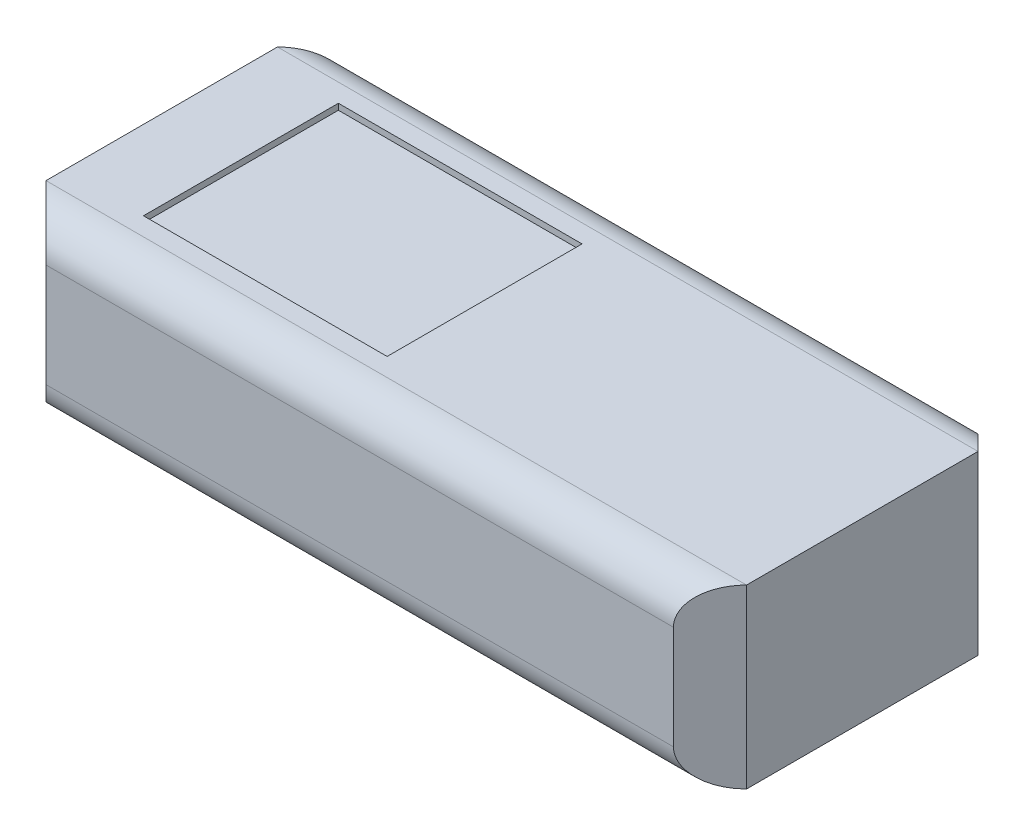
ISO-10303-21;
HEADER;
FILE_DESCRIPTION(('STEP AP214'),'2;1');
FILE_NAME('part.step','',(''),(''),'','','');
FILE_SCHEMA(('AUTOMOTIVE_DESIGN { 1 0 10303 214 1 1 1 1 }'));
ENDSEC;
DATA;
#1=APPLICATION_CONTEXT('core data for automotive mechanical design processes');
#2=APPLICATION_PROTOCOL_DEFINITION('international standard','automotive_design',2000,#1);
#3=PRODUCT_CONTEXT('',#1,'mechanical');
#4=PRODUCT('Part','Part','',(#3));
#5=PRODUCT_RELATED_PRODUCT_CATEGORY('part','',(#4));
#6=PRODUCT_DEFINITION_FORMATION('','',#4);
#7=PRODUCT_DEFINITION_CONTEXT('part definition',#1,'design');
#8=PRODUCT_DEFINITION('design','',#6,#7);
#9=PRODUCT_DEFINITION_SHAPE('','',#8);
#10=(LENGTH_UNIT() NAMED_UNIT(*) SI_UNIT(.MILLI.,.METRE.));
#11=(NAMED_UNIT(*) PLANE_ANGLE_UNIT() SI_UNIT($,.RADIAN.));
#12=(NAMED_UNIT(*) SI_UNIT($,.STERADIAN.) SOLID_ANGLE_UNIT());
#13=UNCERTAINTY_MEASURE_WITH_UNIT(LENGTH_MEASURE(1.E-05),#10,'distance_accuracy_value','');
#14=(GEOMETRIC_REPRESENTATION_CONTEXT(3) GLOBAL_UNCERTAINTY_ASSIGNED_CONTEXT((#13)) GLOBAL_UNIT_ASSIGNED_CONTEXT((#10,
#11,#12)) REPRESENTATION_CONTEXT('',''));
#15=CARTESIAN_POINT('',(0.,0.,0.));
#16=DIRECTION('',(0.,0.,1.));
#17=DIRECTION('',(1.,0.,0.));
#18=AXIS2_PLACEMENT_3D('',#15,#16,#17);
#19=CARTESIAN_POINT('',(-57.5,29.,-25.));
#20=DIRECTION('',(1.,0.,0.));
#21=DIRECTION('',(0.,0.,-1.));
#22=AXIS2_PLACEMENT_3D('',#19,#20,#21);
#23=PLANE('',#22);
#24=DIRECTION('',(0.,-0.26600110526299,0.963972723679912));
#25=VECTOR('',#24,1.);
#26=CARTESIAN_POINT('',(-57.5,13.3262467276994,-8.75017397481112));
#27=LINE('',#26,#25);
#28=CARTESIAN_POINT('',(-57.5,13.3262467276994,-8.75017397481112));
#29=VERTEX_POINT('',#28);
#30=CARTESIAN_POINT('',(-57.5,12.1169292628953,-4.36767695778415));
#31=VERTEX_POINT('',#30);
#32=EDGE_CURVE('E178',#29,#31,#27,.T.);
#33=ORIENTED_EDGE('',*,*,#32,.F.);
#34=CARTESIAN_POINT('',(-57.5,16.1510721858562,-7.9706843942592));
#35=DIRECTION('',(-1.,0.,0.));
#36=DIRECTION('',(0.,0.,1.));
#37=AXIS2_PLACEMENT_3D('',#34,#35,#36);
#38=CIRCLE('',#37,2.93039978078759);
#39=CARTESIAN_POINT('',(-57.5,18.9319085366982,-7.04645927824277));
#40=VERTEX_POINT('',#39);
#41=EDGE_CURVE('E48',#40,#29,#38,.T.);
#42=ORIENTED_EDGE('',*,*,#41,.F.);
#43=DIRECTION('',(0.,0.301819482473594,-0.953365092710747));
#44=VECTOR('',#43,1.);
#45=CARTESIAN_POINT('',(-57.5,18.9319085366982,-7.04645927824277));
#46=LINE('',#45,#44);
#47=CARTESIAN_POINT('',(-57.5,17.5208448838448,-2.58929561472373));
#48=VERTEX_POINT('',#47);
#49=EDGE_CURVE('E166',#48,#40,#46,.T.);
#50=ORIENTED_EDGE('',*,*,#49,.F.);
#51=CARTESIAN_POINT('',(-57.5,12.1497103450549,4.63226334205409));
#52=DIRECTION('',(-1.,0.,0.));
#53=DIRECTION('',(0.,0.,1.));
#54=AXIS2_PLACEMENT_3D('',#51,#52,#53);
#55=CIRCLE('',#54,9.);
#56=EDGE_CURVE('E169',#31,#48,#55,.T.);
#57=ORIENTED_EDGE('',*,*,#56,.F.);
#58=EDGE_LOOP('',(#33,#42,#50,#57));
#59=FACE_BOUND('',#58,.T.);
#60=DIRECTION('',(0.,0.,1.));
#61=VECTOR('',#60,1.);
#62=CARTESIAN_POINT('',(-57.5,29.,-25.));
#63=LINE('',#62,#61);
#64=CARTESIAN_POINT('',(-57.5,29.,-19.));
#65=VERTEX_POINT('',#64);
#66=CARTESIAN_POINT('',(-57.5,29.,19.));
#67=VERTEX_POINT('',#66);
#68=EDGE_CURVE('E219',#65,#67,#63,.T.);
#69=ORIENTED_EDGE('',*,*,#68,.F.);
#70=DIRECTION('',(0.,-1.,0.));
#71=VECTOR('',#70,1.);
#72=CARTESIAN_POINT('',(-57.5,29.,-19.));
#73=LINE('',#72,#71);
#74=CARTESIAN_POINT('',(-57.5,0.,-19.));
#75=VERTEX_POINT('',#74);
#76=EDGE_CURVE('E233',#65,#75,#73,.T.);
#77=ORIENTED_EDGE('',*,*,#76,.T.);
#78=DIRECTION('',(0.,0.,1.));
#79=VECTOR('',#78,1.);
#80=CARTESIAN_POINT('',(-57.5,0.,-25.));
#81=LINE('',#80,#79);
#82=CARTESIAN_POINT('',(-57.5,0.,19.));
#83=VERTEX_POINT('',#82);
#84=EDGE_CURVE('E213',#75,#83,#81,.T.);
#85=ORIENTED_EDGE('',*,*,#84,.T.);
#86=DIRECTION('',(0.,1.,0.));
#87=VECTOR('',#86,1.);
#88=CARTESIAN_POINT('',(-57.5,29.,19.));
#89=LINE('',#88,#87);
#90=EDGE_CURVE('E226',#83,#67,#89,.T.);
#91=ORIENTED_EDGE('',*,*,#90,.T.);
#92=EDGE_LOOP('',(#69,#77,#85,#91));
#93=FACE_BOUND('',#92,.T.);
#94=ADVANCED_FACE('F33',(#59,#93),#23,.F.);
#95=CARTESIAN_POINT('',(-57.5,29.,25.));
#96=DIRECTION('',(0.,0.,-1.));
#97=DIRECTION('',(-1.,0.,0.));
#98=AXIS2_PLACEMENT_3D('',#95,#96,#97);
#99=PLANE('',#98);
#100=DIRECTION('',(0.,-1.,0.));
#101=VECTOR('',#100,1.);
#102=CARTESIAN_POINT('',(-51.5,29.,25.));
#103=LINE('',#102,#101);
#104=CARTESIAN_POINT('',(-51.5,23.,25.));
#105=VERTEX_POINT('',#104);
#106=CARTESIAN_POINT('',(-51.5,6.,25.));
#107=VERTEX_POINT('',#106);
#108=EDGE_CURVE('E251',#105,#107,#103,.T.);
#109=ORIENTED_EDGE('',*,*,#108,.T.);
#110=DIRECTION('',(1.,0.,0.));
#111=VECTOR('',#110,1.);
#112=CARTESIAN_POINT('',(-57.5,6.,25.));
#113=LINE('',#112,#111);
#114=CARTESIAN_POINT('',(51.5,6.,25.));
#115=VERTEX_POINT('',#114);
#116=EDGE_CURVE('E256',#107,#115,#113,.T.);
#117=ORIENTED_EDGE('',*,*,#116,.T.);
#118=DIRECTION('',(0.,1.,0.));
#119=VECTOR('',#118,1.);
#120=CARTESIAN_POINT('',(51.5,29.,25.));
#121=LINE('',#120,#119);
#122=CARTESIAN_POINT('',(51.5,23.,25.));
#123=VERTEX_POINT('',#122);
#124=EDGE_CURVE('E248',#115,#123,#121,.T.);
#125=ORIENTED_EDGE('',*,*,#124,.T.);
#126=DIRECTION('',(1.,0.,0.));
#127=VECTOR('',#126,1.);
#128=CARTESIAN_POINT('',(-51.5,23.,25.));
#129=LINE('',#128,#127);
#130=EDGE_CURVE('E254',#123,#105,#129,.F.);
#131=ORIENTED_EDGE('',*,*,#130,.T.);
#132=EDGE_LOOP('',(#109,#117,#125,#131));
#133=FACE_BOUND('',#132,.T.);
#134=ADVANCED_FACE('F306',(#133),#99,.F.);
#135=CARTESIAN_POINT('',(57.5,29.,-25.));
#136=DIRECTION('',(-1.,0.,0.));
#137=DIRECTION('',(0.,0.,1.));
#138=AXIS2_PLACEMENT_3D('',#135,#136,#137);
#139=PLANE('',#138);
#140=DIRECTION('',(0.,0.,-1.));
#141=VECTOR('',#140,1.);
#142=CARTESIAN_POINT('',(57.5,0.,-25.));
#143=LINE('',#142,#141);
#144=CARTESIAN_POINT('',(57.5,0.,19.));
#145=VERTEX_POINT('',#144);
#146=CARTESIAN_POINT('',(57.5,0.,-19.));
#147=VERTEX_POINT('',#146);
#148=EDGE_CURVE('E223',#145,#147,#143,.T.);
#149=ORIENTED_EDGE('',*,*,#148,.T.);
#150=DIRECTION('',(0.,1.,0.));
#151=VECTOR('',#150,1.);
#152=CARTESIAN_POINT('',(57.5,29.,-19.));
#153=LINE('',#152,#151);
#154=CARTESIAN_POINT('',(57.5,29.,-19.));
#155=VERTEX_POINT('',#154);
#156=EDGE_CURVE('E245',#147,#155,#153,.T.);
#157=ORIENTED_EDGE('',*,*,#156,.T.);
#158=DIRECTION('',(0.,0.,-1.));
#159=VECTOR('',#158,1.);
#160=CARTESIAN_POINT('',(57.5,29.,-25.));
#161=LINE('',#160,#159);
#162=CARTESIAN_POINT('',(57.5,29.,19.));
#163=VERTEX_POINT('',#162);
#164=EDGE_CURVE('E222',#163,#155,#161,.T.);
#165=ORIENTED_EDGE('',*,*,#164,.F.);
#166=DIRECTION('',(0.,-1.,0.));
#167=VECTOR('',#166,1.);
#168=CARTESIAN_POINT('',(57.5,29.,19.));
#169=LINE('',#168,#167);
#170=EDGE_CURVE('E242',#163,#145,#169,.T.);
#171=ORIENTED_EDGE('',*,*,#170,.T.);
#172=EDGE_LOOP('',(#149,#157,#165,#171));
#173=FACE_BOUND('',#172,.T.);
#174=ADVANCED_FACE('F294',(#173),#139,.F.);
#175=CARTESIAN_POINT('',(-57.5,29.,-25.));
#176=DIRECTION('',(0.,0.,1.));
#177=DIRECTION('',(1.,0.,0.));
#178=AXIS2_PLACEMENT_3D('',#175,#176,#177);
#179=PLANE('',#178);
#180=DIRECTION('',(0.,-1.,0.));
#181=VECTOR('',#180,1.);
#182=CARTESIAN_POINT('',(51.5,29.,-25.));
#183=LINE('',#182,#181);
#184=CARTESIAN_POINT('',(51.5,23.,-25.));
#185=VERTEX_POINT('',#184);
#186=CARTESIAN_POINT('',(51.5,6.,-25.));
#187=VERTEX_POINT('',#186);
#188=EDGE_CURVE('E236',#185,#187,#183,.T.);
#189=ORIENTED_EDGE('',*,*,#188,.T.);
#190=DIRECTION('',(-1.,0.,0.));
#191=VECTOR('',#190,1.);
#192=CARTESIAN_POINT('',(-57.5,6.,-25.));
#193=LINE('',#192,#191);
#194=CARTESIAN_POINT('',(-51.5,6.,-25.));
#195=VERTEX_POINT('',#194);
#196=EDGE_CURVE('E273',#187,#195,#193,.T.);
#197=ORIENTED_EDGE('',*,*,#196,.T.);
#198=DIRECTION('',(0.,1.,0.));
#199=VECTOR('',#198,1.);
#200=CARTESIAN_POINT('',(-51.5,29.,-25.));
#201=LINE('',#200,#199);
#202=CARTESIAN_POINT('',(-51.5,23.,-25.));
#203=VERTEX_POINT('',#202);
#204=EDGE_CURVE('E239',#195,#203,#201,.T.);
#205=ORIENTED_EDGE('',*,*,#204,.T.);
#206=DIRECTION('',(-1.,0.,0.));
#207=VECTOR('',#206,1.);
#208=CARTESIAN_POINT('',(51.5,23.,-25.));
#209=LINE('',#208,#207);
#210=EDGE_CURVE('E271',#203,#185,#209,.F.);
#211=ORIENTED_EDGE('',*,*,#210,.T.);
#212=EDGE_LOOP('',(#189,#197,#205,#211));
#213=FACE_BOUND('',#212,.T.);
#214=ADVANCED_FACE('F358',(#213),#179,.F.);
#215=CARTESIAN_POINT('',(-57.5,29.,25.));
#216=DIRECTION('',(0.,1.,0.));
#217=DIRECTION('',(0.,0.,1.));
#218=AXIS2_PLACEMENT_3D('',#215,#216,#217);
#219=PLANE('',#218);
#220=DIRECTION('',(0.,0.,1.));
#221=VECTOR('',#220,1.);
#222=CARTESIAN_POINT('',(-44.5,29.,-16.));
#223=LINE('',#222,#221);
#224=CARTESIAN_POINT('',(-44.5,29.,-16.));
#225=VERTEX_POINT('',#224);
#226=CARTESIAN_POINT('',(-44.5,29.,16.));
#227=VERTEX_POINT('',#226);
#228=EDGE_CURVE('E56',#225,#227,#223,.T.);
#229=ORIENTED_EDGE('',*,*,#228,.F.);
#230=DIRECTION('',(-1.,0.,0.));
#231=VECTOR('',#230,1.);
#232=CARTESIAN_POINT('',(-44.5,29.,-16.));
#233=LINE('',#232,#231);
#234=CARTESIAN_POINT('',(-4.50000000000001,29.,-16.));
#235=VERTEX_POINT('',#234);
#236=EDGE_CURVE('E192',#235,#225,#233,.T.);
#237=ORIENTED_EDGE('',*,*,#236,.F.);
#238=DIRECTION('',(0.,0.,-1.));
#239=VECTOR('',#238,1.);
#240=CARTESIAN_POINT('',(-4.50000000000001,29.,-16.));
#241=LINE('',#240,#239);
#242=CARTESIAN_POINT('',(-4.50000000000001,29.,16.));
#243=VERTEX_POINT('',#242);
#244=EDGE_CURVE('E206',#243,#235,#241,.T.);
#245=ORIENTED_EDGE('',*,*,#244,.F.);
#246=DIRECTION('',(1.,0.,0.));
#247=VECTOR('',#246,1.);
#248=CARTESIAN_POINT('',(-44.5,29.,16.));
#249=LINE('',#248,#247);
#250=EDGE_CURVE('E203',#227,#243,#249,.T.);
#251=ORIENTED_EDGE('',*,*,#250,.F.);
#252=EDGE_LOOP('',(#229,#237,#245,#251));
#253=FACE_BOUND('',#252,.T.);
#254=ORIENTED_EDGE('',*,*,#164,.T.);
#255=DIRECTION('',(-1.,0.,0.));
#256=VECTOR('',#255,1.);
#257=CARTESIAN_POINT('',(-51.5,29.,-19.));
#258=LINE('',#257,#256);
#259=EDGE_CURVE('E11',#155,#65,#258,.T.);
#260=ORIENTED_EDGE('',*,*,#259,.T.);
#261=ORIENTED_EDGE('',*,*,#68,.T.);
#262=DIRECTION('',(1.,0.,0.));
#263=VECTOR('',#262,1.);
#264=CARTESIAN_POINT('',(51.5,29.,19.));
#265=LINE('',#264,#263);
#266=EDGE_CURVE('E41',#67,#163,#265,.T.);
#267=ORIENTED_EDGE('',*,*,#266,.T.);
#268=EDGE_LOOP('',(#254,#260,#261,#267));
#269=FACE_BOUND('',#268,.T.);
#270=ADVANCED_FACE('F287',(#253,#269),#219,.T.);
#271=CARTESIAN_POINT('',(-57.5,0.,25.));
#272=DIRECTION('',(0.,1.,0.));
#273=DIRECTION('',(0.,0.,1.));
#274=AXIS2_PLACEMENT_3D('',#271,#272,#273);
#275=PLANE('',#274);
#276=ORIENTED_EDGE('',*,*,#148,.F.);
#277=DIRECTION('',(1.,0.,0.));
#278=VECTOR('',#277,1.);
#279=CARTESIAN_POINT('',(-57.5,0.,19.));
#280=LINE('',#279,#278);
#281=EDGE_CURVE('E265',#145,#83,#280,.F.);
#282=ORIENTED_EDGE('',*,*,#281,.T.);
#283=ORIENTED_EDGE('',*,*,#84,.F.);
#284=DIRECTION('',(-1.,0.,0.));
#285=VECTOR('',#284,1.);
#286=CARTESIAN_POINT('',(-57.5,0.,-19.));
#287=LINE('',#286,#285);
#288=EDGE_CURVE('E263',#75,#147,#287,.F.);
#289=ORIENTED_EDGE('',*,*,#288,.T.);
#290=EDGE_LOOP('',(#276,#282,#283,#289));
#291=FACE_BOUND('',#290,.T.);
#292=ADVANCED_FACE('F337',(#291),#275,.F.);
#293=CARTESIAN_POINT('',(-57.5,29.,-19.));
#294=DIRECTION('',(0.707106781186546,0.,0.707106781186549));
#295=DIRECTION('',(0.707106781186549,0.,-0.707106781186546));
#296=AXIS2_PLACEMENT_3D('',#293,#294,#295);
#297=PLANE('',#296);
#298=ORIENTED_EDGE('',*,*,#204,.F.);
#299=CARTESIAN_POINT('',(-57.5,6.,-19.));
#300=DIRECTION('',(0.707106781186546,0.,0.707106781186549));
#301=DIRECTION('',(-0.707106781186549,0.,0.707106781186546));
#302=AXIS2_PLACEMENT_3D('',#299,#300,#301);
#303=ELLIPSE('',#302,8.48528137423859,6.);
#304=EDGE_CURVE('E278',#195,#75,#303,.F.);
#305=ORIENTED_EDGE('',*,*,#304,.T.);
#306=ORIENTED_EDGE('',*,*,#76,.F.);
#307=CARTESIAN_POINT('',(-57.5,23.,-19.));
#308=DIRECTION('',(0.707106781186546,0.,0.707106781186549));
#309=DIRECTION('',(0.707106781186549,0.,-0.707106781186546));
#310=AXIS2_PLACEMENT_3D('',#307,#308,#309);
#311=ELLIPSE('',#310,8.48528137423859,6.);
#312=EDGE_CURVE('E276',#65,#203,#311,.F.);
#313=ORIENTED_EDGE('',*,*,#312,.T.);
#314=EDGE_LOOP('',(#298,#305,#306,#313));
#315=FACE_BOUND('',#314,.T.);
#316=ADVANCED_FACE('F333',(#315),#297,.F.);
#317=CARTESIAN_POINT('',(51.5,29.,-25.));
#318=DIRECTION('',(-0.707106781186549,0.,0.707106781186546));
#319=DIRECTION('',(0.707106781186546,0.,0.707106781186549));
#320=AXIS2_PLACEMENT_3D('',#317,#318,#319);
#321=PLANE('',#320);
#322=ORIENTED_EDGE('',*,*,#156,.F.);
#323=CARTESIAN_POINT('',(57.5,6.,-19.));
#324=DIRECTION('',(-0.707106781186549,0.,0.707106781186546));
#325=DIRECTION('',(-0.707106781186546,0.,-0.707106781186549));
#326=AXIS2_PLACEMENT_3D('',#323,#324,#325);
#327=ELLIPSE('',#326,8.48528137423855,6.);
#328=EDGE_CURVE('E282',#147,#187,#327,.F.);
#329=ORIENTED_EDGE('',*,*,#328,.T.);
#330=ORIENTED_EDGE('',*,*,#188,.F.);
#331=CARTESIAN_POINT('',(57.5,23.,-19.));
#332=DIRECTION('',(-0.707106781186549,0.,0.707106781186546));
#333=DIRECTION('',(0.707106781186546,0.,0.707106781186549));
#334=AXIS2_PLACEMENT_3D('',#331,#332,#333);
#335=ELLIPSE('',#334,8.48528137423855,6.);
#336=EDGE_CURVE('E280',#185,#155,#335,.F.);
#337=ORIENTED_EDGE('',*,*,#336,.T.);
#338=EDGE_LOOP('',(#322,#329,#330,#337));
#339=FACE_BOUND('',#338,.T.);
#340=ADVANCED_FACE('F336',(#339),#321,.F.);
#341=CARTESIAN_POINT('',(-51.5,29.,25.));
#342=DIRECTION('',(0.707106781186549,0.,-0.707106781186546));
#343=DIRECTION('',(-0.707106781186546,0.,-0.707106781186549));
#344=AXIS2_PLACEMENT_3D('',#341,#342,#343);
#345=PLANE('',#344);
#346=ORIENTED_EDGE('',*,*,#90,.F.);
#347=CARTESIAN_POINT('',(-57.5,6.,19.));
#348=DIRECTION('',(0.707106781186549,0.,-0.707106781186546));
#349=DIRECTION('',(0.707106781186546,0.,0.707106781186549));
#350=AXIS2_PLACEMENT_3D('',#347,#348,#349);
#351=ELLIPSE('',#350,8.48528137423856,6.);
#352=EDGE_CURVE('E269',#83,#107,#351,.F.);
#353=ORIENTED_EDGE('',*,*,#352,.T.);
#354=ORIENTED_EDGE('',*,*,#108,.F.);
#355=CARTESIAN_POINT('',(-57.5,23.,19.));
#356=DIRECTION('',(0.707106781186549,0.,-0.707106781186546));
#357=DIRECTION('',(-0.707106781186546,0.,-0.707106781186549));
#358=AXIS2_PLACEMENT_3D('',#355,#356,#357);
#359=ELLIPSE('',#358,8.48528137423856,6.);
#360=EDGE_CURVE('E267',#105,#67,#359,.F.);
#361=ORIENTED_EDGE('',*,*,#360,.T.);
#362=EDGE_LOOP('',(#346,#353,#354,#361));
#363=FACE_BOUND('',#362,.T.);
#364=ADVANCED_FACE('F311',(#363),#345,.F.);
#365=CARTESIAN_POINT('',(57.5,29.,19.));
#366=DIRECTION('',(-0.707106781186546,0.,-0.707106781186549));
#367=DIRECTION('',(-0.707106781186549,0.,0.707106781186546));
#368=AXIS2_PLACEMENT_3D('',#365,#366,#367);
#369=PLANE('',#368);
#370=ORIENTED_EDGE('',*,*,#124,.F.);
#371=CARTESIAN_POINT('',(57.5,6.,19.));
#372=DIRECTION('',(-0.707106781186546,0.,-0.707106781186549));
#373=DIRECTION('',(0.707106781186549,0.,-0.707106781186546));
#374=AXIS2_PLACEMENT_3D('',#371,#372,#373);
#375=ELLIPSE('',#374,8.48528137423859,6.);
#376=EDGE_CURVE('E261',#115,#145,#375,.F.);
#377=ORIENTED_EDGE('',*,*,#376,.T.);
#378=ORIENTED_EDGE('',*,*,#170,.F.);
#379=CARTESIAN_POINT('',(57.5,23.,19.));
#380=DIRECTION('',(-0.707106781186546,0.,-0.707106781186549));
#381=DIRECTION('',(-0.707106781186549,0.,0.707106781186546));
#382=AXIS2_PLACEMENT_3D('',#379,#380,#381);
#383=ELLIPSE('',#382,8.48528137423859,6.);
#384=EDGE_CURVE('E259',#163,#123,#383,.F.);
#385=ORIENTED_EDGE('',*,*,#384,.T.);
#386=EDGE_LOOP('',(#370,#377,#378,#385));
#387=FACE_BOUND('',#386,.T.);
#388=ADVANCED_FACE('F299',(#387),#369,.F.);
#389=CARTESIAN_POINT('',(-57.5,6.,19.));
#390=DIRECTION('',(1.,0.,0.));
#391=DIRECTION('',(0.,0.,-1.));
#392=AXIS2_PLACEMENT_3D('',#389,#390,#391);
#393=CYLINDRICAL_SURFACE('',#392,6.);
#394=ORIENTED_EDGE('',*,*,#352,.F.);
#395=ORIENTED_EDGE('',*,*,#281,.F.);
#396=ORIENTED_EDGE('',*,*,#376,.F.);
#397=ORIENTED_EDGE('',*,*,#116,.F.);
#398=EDGE_LOOP('',(#394,#395,#396,#397));
#399=FACE_BOUND('',#398,.T.);
#400=ADVANCED_FACE('F304',(#399),#393,.T.);
#401=CARTESIAN_POINT('',(-57.5,6.,-19.));
#402=DIRECTION('',(-1.,0.,0.));
#403=DIRECTION('',(0.,0.,1.));
#404=AXIS2_PLACEMENT_3D('',#401,#402,#403);
#405=CYLINDRICAL_SURFACE('',#404,6.);
#406=ORIENTED_EDGE('',*,*,#328,.F.);
#407=ORIENTED_EDGE('',*,*,#288,.F.);
#408=ORIENTED_EDGE('',*,*,#304,.F.);
#409=ORIENTED_EDGE('',*,*,#196,.F.);
#410=EDGE_LOOP('',(#406,#407,#408,#409));
#411=FACE_BOUND('',#410,.T.);
#412=ADVANCED_FACE('F321',(#411),#405,.T.);
#413=CARTESIAN_POINT('',(-57.5,23.,-19.));
#414=DIRECTION('',(1.,0.,0.));
#415=DIRECTION('',(0.,0.,-1.));
#416=AXIS2_PLACEMENT_3D('',#413,#414,#415);
#417=CYLINDRICAL_SURFACE('',#416,6.);
#418=ORIENTED_EDGE('',*,*,#336,.F.);
#419=ORIENTED_EDGE('',*,*,#210,.F.);
#420=ORIENTED_EDGE('',*,*,#312,.F.);
#421=ORIENTED_EDGE('',*,*,#259,.F.);
#422=EDGE_LOOP('',(#418,#419,#420,#421));
#423=FACE_BOUND('',#422,.T.);
#424=ADVANCED_FACE('F314',(#423),#417,.T.);
#425=CARTESIAN_POINT('',(-57.5,23.,19.));
#426=DIRECTION('',(-1.,0.,0.));
#427=DIRECTION('',(0.,0.,1.));
#428=AXIS2_PLACEMENT_3D('',#425,#426,#427);
#429=CYLINDRICAL_SURFACE('',#428,6.);
#430=ORIENTED_EDGE('',*,*,#360,.F.);
#431=ORIENTED_EDGE('',*,*,#130,.F.);
#432=ORIENTED_EDGE('',*,*,#384,.F.);
#433=ORIENTED_EDGE('',*,*,#266,.F.);
#434=EDGE_LOOP('',(#430,#431,#432,#433));
#435=FACE_BOUND('',#434,.T.);
#436=ADVANCED_FACE('F35',(#435),#429,.T.);
#437=CARTESIAN_POINT('',(-44.5,28.,-16.));
#438=DIRECTION('',(-1.,0.,0.));
#439=DIRECTION('',(0.,0.,1.));
#440=AXIS2_PLACEMENT_3D('',#437,#438,#439);
#441=PLANE('',#440);
#442=ORIENTED_EDGE('',*,*,#228,.T.);
#443=DIRECTION('',(0.,1.,0.));
#444=VECTOR('',#443,1.);
#445=CARTESIAN_POINT('',(-44.5,28.,16.));
#446=LINE('',#445,#444);
#447=CARTESIAN_POINT('',(-44.5,28.,16.));
#448=VERTEX_POINT('',#447);
#449=EDGE_CURVE('E201',#448,#227,#446,.T.);
#450=ORIENTED_EDGE('',*,*,#449,.F.);
#451=DIRECTION('',(0.,0.,1.));
#452=VECTOR('',#451,1.);
#453=CARTESIAN_POINT('',(-44.5,28.,-16.));
#454=LINE('',#453,#452);
#455=CARTESIAN_POINT('',(-44.5,28.,-16.));
#456=VERTEX_POINT('',#455);
#457=EDGE_CURVE('E188',#456,#448,#454,.T.);
#458=ORIENTED_EDGE('',*,*,#457,.F.);
#459=DIRECTION('',(0.,1.,0.));
#460=VECTOR('',#459,1.);
#461=CARTESIAN_POINT('',(-44.5,28.,-16.));
#462=LINE('',#461,#460);
#463=EDGE_CURVE('E211',#456,#225,#462,.T.);
#464=ORIENTED_EDGE('',*,*,#463,.T.);
#465=EDGE_LOOP('',(#442,#450,#458,#464));
#466=FACE_BOUND('',#465,.T.);
#467=ADVANCED_FACE('F313',(#466),#441,.F.);
#468=CARTESIAN_POINT('',(-44.5,28.,-16.));
#469=DIRECTION('',(0.,0.,-1.));
#470=DIRECTION('',(-1.,0.,0.));
#471=AXIS2_PLACEMENT_3D('',#468,#469,#470);
#472=PLANE('',#471);
#473=ORIENTED_EDGE('',*,*,#236,.T.);
#474=ORIENTED_EDGE('',*,*,#463,.F.);
#475=DIRECTION('',(-1.,0.,0.));
#476=VECTOR('',#475,1.);
#477=CARTESIAN_POINT('',(-44.5,28.,-16.));
#478=LINE('',#477,#476);
#479=CARTESIAN_POINT('',(-4.50000000000001,28.,-16.));
#480=VERTEX_POINT('',#479);
#481=EDGE_CURVE('E198',#480,#456,#478,.T.);
#482=ORIENTED_EDGE('',*,*,#481,.F.);
#483=DIRECTION('',(0.,1.,0.));
#484=VECTOR('',#483,1.);
#485=CARTESIAN_POINT('',(-4.50000000000001,28.,-16.));
#486=LINE('',#485,#484);
#487=EDGE_CURVE('E214',#480,#235,#486,.T.);
#488=ORIENTED_EDGE('',*,*,#487,.T.);
#489=EDGE_LOOP('',(#473,#474,#482,#488));
#490=FACE_BOUND('',#489,.T.);
#491=ADVANCED_FACE('F319',(#490),#472,.F.);
#492=CARTESIAN_POINT('',(-4.50000000000001,28.,-16.));
#493=DIRECTION('',(1.,0.,0.));
#494=DIRECTION('',(0.,0.,-1.));
#495=AXIS2_PLACEMENT_3D('',#492,#493,#494);
#496=PLANE('',#495);
#497=ORIENTED_EDGE('',*,*,#244,.T.);
#498=ORIENTED_EDGE('',*,*,#487,.F.);
#499=DIRECTION('',(0.,0.,-1.));
#500=VECTOR('',#499,1.);
#501=CARTESIAN_POINT('',(-4.50000000000001,28.,-16.));
#502=LINE('',#501,#500);
#503=CARTESIAN_POINT('',(-4.50000000000001,28.,16.));
#504=VERTEX_POINT('',#503);
#505=EDGE_CURVE('E195',#504,#480,#502,.T.);
#506=ORIENTED_EDGE('',*,*,#505,.F.);
#507=DIRECTION('',(0.,1.,0.));
#508=VECTOR('',#507,1.);
#509=CARTESIAN_POINT('',(-4.50000000000001,28.,16.));
#510=LINE('',#509,#508);
#511=EDGE_CURVE('E216',#504,#243,#510,.T.);
#512=ORIENTED_EDGE('',*,*,#511,.T.);
#513=EDGE_LOOP('',(#497,#498,#506,#512));
#514=FACE_BOUND('',#513,.T.);
#515=ADVANCED_FACE('F405',(#514),#496,.F.);
#516=CARTESIAN_POINT('',(-44.5,28.,16.));
#517=DIRECTION('',(0.,0.,1.));
#518=DIRECTION('',(1.,0.,0.));
#519=AXIS2_PLACEMENT_3D('',#516,#517,#518);
#520=PLANE('',#519);
#521=ORIENTED_EDGE('',*,*,#250,.T.);
#522=ORIENTED_EDGE('',*,*,#511,.F.);
#523=DIRECTION('',(1.,0.,0.));
#524=VECTOR('',#523,1.);
#525=CARTESIAN_POINT('',(-44.5,28.,16.));
#526=LINE('',#525,#524);
#527=EDGE_CURVE('E191',#448,#504,#526,.T.);
#528=ORIENTED_EDGE('',*,*,#527,.F.);
#529=ORIENTED_EDGE('',*,*,#449,.T.);
#530=EDGE_LOOP('',(#521,#522,#528,#529));
#531=FACE_BOUND('',#530,.T.);
#532=ADVANCED_FACE('F415',(#531),#520,.F.);
#533=CARTESIAN_POINT('',(-44.5,28.,16.));
#534=DIRECTION('',(0.,1.,0.));
#535=DIRECTION('',(0.,0.,1.));
#536=AXIS2_PLACEMENT_3D('',#533,#534,#535);
#537=PLANE('',#536);
#538=ORIENTED_EDGE('',*,*,#457,.T.);
#539=ORIENTED_EDGE('',*,*,#527,.T.);
#540=ORIENTED_EDGE('',*,*,#505,.T.);
#541=ORIENTED_EDGE('',*,*,#481,.T.);
#542=EDGE_LOOP('',(#538,#539,#540,#541));
#543=FACE_BOUND('',#542,.T.);
#544=ADVANCED_FACE('F425',(#543),#537,.T.);
#545=CARTESIAN_POINT('',(-53.5,16.1510721858562,-7.9706843942592));
#546=DIRECTION('',(-1.,0.,0.));
#547=DIRECTION('',(0.,0.,1.));
#548=AXIS2_PLACEMENT_3D('',#545,#546,#547);
#549=CYLINDRICAL_SURFACE('',#548,2.93039978078759);
#550=ORIENTED_EDGE('',*,*,#41,.T.);
#551=DIRECTION('',(-1.,0.,0.));
#552=VECTOR('',#551,1.);
#553=CARTESIAN_POINT('',(-53.5,13.3262467276994,-8.75017397481112));
#554=LINE('',#553,#552);
#555=CARTESIAN_POINT('',(-53.5,13.3262467276994,-8.75017397481112));
#556=VERTEX_POINT('',#555);
#557=EDGE_CURVE('E144',#556,#29,#554,.T.);
#558=ORIENTED_EDGE('',*,*,#557,.F.);
#559=CARTESIAN_POINT('',(-53.5,16.1510721858562,-7.9706843942592));
#560=DIRECTION('',(-1.,0.,0.));
#561=DIRECTION('',(0.,0.,1.));
#562=AXIS2_PLACEMENT_3D('',#559,#560,#561);
#563=CIRCLE('',#562,2.93039978078759);
#564=CARTESIAN_POINT('',(-53.5,18.9319085366982,-7.04645927824277));
#565=VERTEX_POINT('',#564);
#566=EDGE_CURVE('E148',#565,#556,#563,.T.);
#567=ORIENTED_EDGE('',*,*,#566,.F.);
#568=DIRECTION('',(-1.,0.,0.));
#569=VECTOR('',#568,1.);
#570=CARTESIAN_POINT('',(-53.5,18.9319085366982,-7.04645927824277));
#571=LINE('',#570,#569);
#572=EDGE_CURVE('E183',#565,#40,#571,.T.);
#573=ORIENTED_EDGE('',*,*,#572,.T.);
#574=EDGE_LOOP('',(#550,#558,#567,#573));
#575=FACE_BOUND('',#574,.T.);
#576=ADVANCED_FACE('F146',(#575),#549,.F.);
#577=CARTESIAN_POINT('',(-53.5,18.9319085366982,-7.04645927824277));
#578=DIRECTION('',(0.,0.953365092710747,0.301819482473594));
#579=DIRECTION('',(0.,-0.301819482473594,0.953365092710748));
#580=AXIS2_PLACEMENT_3D('',#577,#578,#579);
#581=PLANE('',#580);
#582=ORIENTED_EDGE('',*,*,#49,.T.);
#583=ORIENTED_EDGE('',*,*,#572,.F.);
#584=DIRECTION('',(0.,0.301819482473594,-0.953365092710747));
#585=VECTOR('',#584,1.);
#586=CARTESIAN_POINT('',(-53.5,18.9319085366982,-7.04645927824277));
#587=LINE('',#586,#585);
#588=CARTESIAN_POINT('',(-53.5,17.5208448838448,-2.58929561472374));
#589=VERTEX_POINT('',#588);
#590=EDGE_CURVE('E154',#589,#565,#587,.T.);
#591=ORIENTED_EDGE('',*,*,#590,.F.);
#592=DIRECTION('',(-1.,0.,0.));
#593=VECTOR('',#592,1.);
#594=CARTESIAN_POINT('',(-53.5,17.5208448838448,-2.58929561472374));
#595=LINE('',#594,#593);
#596=EDGE_CURVE('E185',#589,#48,#595,.T.);
#597=ORIENTED_EDGE('',*,*,#596,.T.);
#598=EDGE_LOOP('',(#582,#583,#591,#597));
#599=FACE_BOUND('',#598,.T.);
#600=ADVANCED_FACE('F449',(#599),#581,.F.);
#601=CARTESIAN_POINT('',(-53.5,12.1497103450549,4.63226334205409));
#602=DIRECTION('',(-1.,0.,0.));
#603=DIRECTION('',(0.,0.,1.));
#604=AXIS2_PLACEMENT_3D('',#601,#602,#603);
#605=CYLINDRICAL_SURFACE('',#604,9.);
#606=ORIENTED_EDGE('',*,*,#56,.T.);
#607=ORIENTED_EDGE('',*,*,#596,.F.);
#608=CARTESIAN_POINT('',(-53.5,12.1497103450549,4.63226334205409));
#609=DIRECTION('',(-1.,0.,0.));
#610=DIRECTION('',(0.,0.,1.));
#611=AXIS2_PLACEMENT_3D('',#608,#609,#610);
#612=CIRCLE('',#611,9.);
#613=CARTESIAN_POINT('',(-53.5,12.1169292628953,-4.36767695778415));
#614=VERTEX_POINT('',#613);
#615=EDGE_CURVE('E162',#614,#589,#612,.T.);
#616=ORIENTED_EDGE('',*,*,#615,.F.);
#617=DIRECTION('',(-1.,0.,0.));
#618=VECTOR('',#617,1.);
#619=CARTESIAN_POINT('',(-53.5,12.1169292628953,-4.36767695778415));
#620=LINE('',#619,#618);
#621=EDGE_CURVE('E153',#614,#31,#620,.T.);
#622=ORIENTED_EDGE('',*,*,#621,.T.);
#623=EDGE_LOOP('',(#606,#607,#616,#622));
#624=FACE_BOUND('',#623,.T.);
#625=ADVANCED_FACE('F458',(#624),#605,.F.);
#626=CARTESIAN_POINT('',(-53.5,13.3262467276994,-8.75017397481112));
#627=DIRECTION('',(0.,-0.963972723679912,-0.26600110526299));
#628=DIRECTION('',(0.,0.26600110526299,-0.963972723679912));
#629=AXIS2_PLACEMENT_3D('',#626,#627,#628);
#630=PLANE('',#629);
#631=ORIENTED_EDGE('',*,*,#32,.T.);
#632=ORIENTED_EDGE('',*,*,#621,.F.);
#633=DIRECTION('',(0.,-0.26600110526299,0.963972723679912));
#634=VECTOR('',#633,1.);
#635=CARTESIAN_POINT('',(-53.5,13.3262467276994,-8.75017397481112));
#636=LINE('',#635,#634);
#637=EDGE_CURVE('E157',#556,#614,#636,.T.);
#638=ORIENTED_EDGE('',*,*,#637,.F.);
#639=ORIENTED_EDGE('',*,*,#557,.T.);
#640=EDGE_LOOP('',(#631,#632,#638,#639));
#641=FACE_BOUND('',#640,.T.);
#642=ADVANCED_FACE('F158',(#641),#630,.F.);
#643=CARTESIAN_POINT('',(-53.5,16.1510721858562,-7.9706843942592));
#644=DIRECTION('',(-1.,0.,0.));
#645=DIRECTION('',(0.,0.,1.));
#646=AXIS2_PLACEMENT_3D('',#643,#644,#645);
#647=PLANE('',#646);
#648=CARTESIAN_POINT('',(-53.5,14.069543064582,-2.1168303115304));
#649=DIRECTION('',(-1.,0.,0.));
#650=DIRECTION('',(0.,0.,1.));
#651=AXIS2_PLACEMENT_3D('',#648,#649,#650);
#652=CIRCLE('',#651,2.03126432645053);
#653=CARTESIAN_POINT('',(-53.5,14.069543064582,-0.0855659850798711));
#654=VERTEX_POINT('',#653);
#655=EDGE_CURVE('E172',#654,#654,#652,.T.);
#656=ORIENTED_EDGE('',*,*,#655,.F.);
#657=EDGE_LOOP('',(#656));
#658=FACE_BOUND('',#657,.T.);
#659=ORIENTED_EDGE('',*,*,#566,.T.);
#660=ORIENTED_EDGE('',*,*,#637,.T.);
#661=ORIENTED_EDGE('',*,*,#615,.T.);
#662=ORIENTED_EDGE('',*,*,#590,.T.);
#663=EDGE_LOOP('',(#659,#660,#661,#662));
#664=FACE_BOUND('',#663,.T.);
#665=ADVANCED_FACE('F164',(#658,#664),#647,.T.);
#666=CARTESIAN_POINT('',(-49.5,14.069543064582,-2.1168303115304));
#667=DIRECTION('',(-1.,0.,0.));
#668=DIRECTION('',(0.,0.,1.));
#669=AXIS2_PLACEMENT_3D('',#666,#667,#668);
#670=CYLINDRICAL_SURFACE('',#669,2.03126432645053);
#671=CARTESIAN_POINT('',(-49.5,14.069543064582,-2.1168303115304));
#672=DIRECTION('',(-1.,0.,0.));
#673=DIRECTION('',(0.,0.,1.));
#674=AXIS2_PLACEMENT_3D('',#671,#672,#673);
#675=CIRCLE('',#674,2.03126432645053);
#676=CARTESIAN_POINT('',(-49.5,14.069543064582,-0.0855659850798715));
#677=VERTEX_POINT('',#676);
#678=EDGE_CURVE('E179',#677,#677,#675,.T.);
#679=ORIENTED_EDGE('',*,*,#678,.F.);
#680=EDGE_LOOP('',(#679));
#681=FACE_BOUND('',#680,.T.);
#682=ORIENTED_EDGE('',*,*,#655,.T.);
#683=EDGE_LOOP('',(#682));
#684=FACE_BOUND('',#683,.T.);
#685=ADVANCED_FACE('F485',(#681,#684),#670,.F.);
#686=CARTESIAN_POINT('',(-49.5,14.069543064582,-2.1168303115304));
#687=DIRECTION('',(-1.,0.,0.));
#688=DIRECTION('',(0.,0.,1.));
#689=AXIS2_PLACEMENT_3D('',#686,#687,#688);
#690=PLANE('',#689);
#691=ORIENTED_EDGE('',*,*,#678,.T.);
#692=EDGE_LOOP('',(#691));
#693=FACE_BOUND('',#692,.T.);
#694=ADVANCED_FACE('F495',(#693),#690,.T.);
#695=CLOSED_SHELL('',(#94,#134,#174,#214,#270,#292,#316,#340,#364,#388,#400,#412,#424,#436,#467,
#491,#515,#532,#544,#576,#600,#625,#642,#665,#685,#694));
#696=MANIFOLD_SOLID_BREP('B2',#695);
#697=ADVANCED_BREP_SHAPE_REPRESENTATION('',(#18,#696),#14);
#698=SHAPE_DEFINITION_REPRESENTATION(#9,#697);
ENDSEC;
END-ISO-10303-21;
